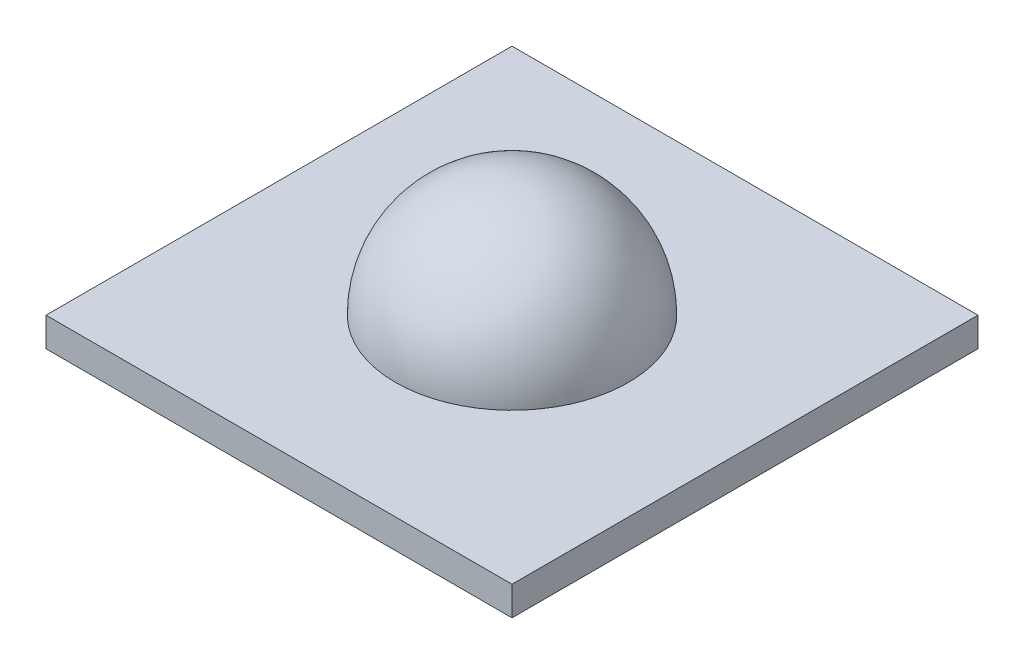
ISO-10303-21;
HEADER;
FILE_DESCRIPTION(('STEP AP214'),'2;1');
FILE_NAME('part.step','',(''),(''),'','','');
FILE_SCHEMA(('AUTOMOTIVE_DESIGN { 1 0 10303 214 1 1 1 1 }'));
ENDSEC;
DATA;
#1=APPLICATION_CONTEXT('core data for automotive mechanical design processes');
#2=APPLICATION_PROTOCOL_DEFINITION('international standard','automotive_design',2000,#1);
#3=PRODUCT_CONTEXT('',#1,'mechanical');
#4=PRODUCT('Part','Part','',(#3));
#5=PRODUCT_RELATED_PRODUCT_CATEGORY('part','',(#4));
#6=PRODUCT_DEFINITION_FORMATION('','',#4);
#7=PRODUCT_DEFINITION_CONTEXT('part definition',#1,'design');
#8=PRODUCT_DEFINITION('design','',#6,#7);
#9=PRODUCT_DEFINITION_SHAPE('','',#8);
#10=(LENGTH_UNIT() NAMED_UNIT(*) SI_UNIT(.MILLI.,.METRE.));
#11=(NAMED_UNIT(*) PLANE_ANGLE_UNIT() SI_UNIT($,.RADIAN.));
#12=(NAMED_UNIT(*) SI_UNIT($,.STERADIAN.) SOLID_ANGLE_UNIT());
#13=UNCERTAINTY_MEASURE_WITH_UNIT(LENGTH_MEASURE(1.E-05),#10,'distance_accuracy_value','');
#14=(GEOMETRIC_REPRESENTATION_CONTEXT(3) GLOBAL_UNCERTAINTY_ASSIGNED_CONTEXT((#13)) GLOBAL_UNIT_ASSIGNED_CONTEXT((#10,
#11,#12)) REPRESENTATION_CONTEXT('',''));
#15=CARTESIAN_POINT('',(0.,0.,0.));
#16=DIRECTION('',(0.,0.,1.));
#17=DIRECTION('',(1.,0.,0.));
#18=AXIS2_PLACEMENT_3D('',#15,#16,#17);
#19=CARTESIAN_POINT('',(0.,5.,0.));
#20=DIRECTION('',(0.,1.,0.));
#21=DIRECTION('',(0.,0.,1.));
#22=AXIS2_PLACEMENT_3D('',#19,#20,#21);
#23=PLANE('',#22);
#24=DIRECTION('',(0.,0.,1.));
#25=VECTOR('',#24,1.);
#26=CARTESIAN_POINT('',(-40.,5.,-40.));
#27=LINE('',#26,#25);
#28=CARTESIAN_POINT('',(-40.,5.,-40.));
#29=VERTEX_POINT('',#28);
#30=CARTESIAN_POINT('',(-40.,5.,40.));
#31=VERTEX_POINT('',#30);
#32=EDGE_CURVE('E84',#29,#31,#27,.T.);
#33=ORIENTED_EDGE('',*,*,#32,.T.);
#34=DIRECTION('',(1.,0.,0.));
#35=VECTOR('',#34,1.);
#36=CARTESIAN_POINT('',(-40.,5.,40.));
#37=LINE('',#36,#35);
#38=CARTESIAN_POINT('',(40.,5.,40.));
#39=VERTEX_POINT('',#38);
#40=EDGE_CURVE('E79',#31,#39,#37,.T.);
#41=ORIENTED_EDGE('',*,*,#40,.T.);
#42=DIRECTION('',(0.,0.,-1.));
#43=VECTOR('',#42,1.);
#44=CARTESIAN_POINT('',(40.,5.,-40.));
#45=LINE('',#44,#43);
#46=CARTESIAN_POINT('',(40.,5.,-40.));
#47=VERTEX_POINT('',#46);
#48=EDGE_CURVE('E82',#39,#47,#45,.T.);
#49=ORIENTED_EDGE('',*,*,#48,.T.);
#50=DIRECTION('',(-1.,0.,0.));
#51=VECTOR('',#50,1.);
#52=CARTESIAN_POINT('',(-40.,5.,-40.));
#53=LINE('',#52,#51);
#54=EDGE_CURVE('E49',#47,#29,#53,.T.);
#55=ORIENTED_EDGE('',*,*,#54,.T.);
#56=EDGE_LOOP('',(#33,#41,#49,#55));
#57=FACE_BOUND('',#56,.T.);
#58=CARTESIAN_POINT('',(0.,5.,0.));
#59=DIRECTION('',(0.,-1.,0.));
#60=DIRECTION('',(0.,0.,-1.));
#61=AXIS2_PLACEMENT_3D('',#58,#59,#60);
#62=CIRCLE('',#61,20.);
#63=CARTESIAN_POINT('',(0.,5.,-20.));
#64=VERTEX_POINT('',#63);
#65=EDGE_CURVE('E99',#64,#64,#62,.T.);
#66=ORIENTED_EDGE('',*,*,#65,.T.);
#67=EDGE_LOOP('',(#66));
#68=FACE_BOUND('',#67,.T.);
#69=ADVANCED_FACE('F32',(#57,#68),#23,.T.);
#70=CARTESIAN_POINT('',(-40.,5.,-40.));
#71=DIRECTION('',(1.,0.,0.));
#72=DIRECTION('',(0.,0.,-1.));
#73=AXIS2_PLACEMENT_3D('',#70,#71,#72);
#74=PLANE('',#73);
#75=DIRECTION('',(0.,0.,1.));
#76=VECTOR('',#75,1.);
#77=CARTESIAN_POINT('',(-40.,0.,-40.));
#78=LINE('',#77,#76);
#79=CARTESIAN_POINT('',(-40.,0.,-40.));
#80=VERTEX_POINT('',#79);
#81=CARTESIAN_POINT('',(-40.,0.,40.));
#82=VERTEX_POINT('',#81);
#83=EDGE_CURVE('E96',#80,#82,#78,.T.);
#84=ORIENTED_EDGE('',*,*,#83,.T.);
#85=DIRECTION('',(0.,-1.,0.));
#86=VECTOR('',#85,1.);
#87=CARTESIAN_POINT('',(-40.,5.,40.));
#88=LINE('',#87,#86);
#89=EDGE_CURVE('E11',#31,#82,#88,.T.);
#90=ORIENTED_EDGE('',*,*,#89,.F.);
#91=ORIENTED_EDGE('',*,*,#32,.F.);
#92=DIRECTION('',(0.,-1.,0.));
#93=VECTOR('',#92,1.);
#94=CARTESIAN_POINT('',(-40.,5.,-40.));
#95=LINE('',#94,#93);
#96=EDGE_CURVE('E92',#29,#80,#95,.T.);
#97=ORIENTED_EDGE('',*,*,#96,.T.);
#98=EDGE_LOOP('',(#84,#90,#91,#97));
#99=FACE_BOUND('',#98,.T.);
#100=ADVANCED_FACE('F34',(#99),#74,.F.);
#101=CARTESIAN_POINT('',(-40.,5.,40.));
#102=DIRECTION('',(0.,0.,-1.));
#103=DIRECTION('',(-1.,0.,0.));
#104=AXIS2_PLACEMENT_3D('',#101,#102,#103);
#105=PLANE('',#104);
#106=DIRECTION('',(1.,0.,0.));
#107=VECTOR('',#106,1.);
#108=CARTESIAN_POINT('',(-40.,0.,40.));
#109=LINE('',#108,#107);
#110=CARTESIAN_POINT('',(40.,0.,40.));
#111=VERTEX_POINT('',#110);
#112=EDGE_CURVE('E88',#82,#111,#109,.T.);
#113=ORIENTED_EDGE('',*,*,#112,.T.);
#114=DIRECTION('',(0.,-1.,0.));
#115=VECTOR('',#114,1.);
#116=CARTESIAN_POINT('',(40.,5.,40.));
#117=LINE('',#116,#115);
#118=EDGE_CURVE('E41',#39,#111,#117,.T.);
#119=ORIENTED_EDGE('',*,*,#118,.F.);
#120=ORIENTED_EDGE('',*,*,#40,.F.);
#121=ORIENTED_EDGE('',*,*,#89,.T.);
#122=EDGE_LOOP('',(#113,#119,#120,#121));
#123=FACE_BOUND('',#122,.T.);
#124=ADVANCED_FACE('F87',(#123),#105,.F.);
#125=CARTESIAN_POINT('',(40.,5.,-40.));
#126=DIRECTION('',(-1.,0.,0.));
#127=DIRECTION('',(0.,0.,1.));
#128=AXIS2_PLACEMENT_3D('',#125,#126,#127);
#129=PLANE('',#128);
#130=DIRECTION('',(0.,0.,-1.));
#131=VECTOR('',#130,1.);
#132=CARTESIAN_POINT('',(40.,0.,-40.));
#133=LINE('',#132,#131);
#134=CARTESIAN_POINT('',(40.,0.,-40.));
#135=VERTEX_POINT('',#134);
#136=EDGE_CURVE('E66',#111,#135,#133,.T.);
#137=ORIENTED_EDGE('',*,*,#136,.T.);
#138=DIRECTION('',(0.,-1.,0.));
#139=VECTOR('',#138,1.);
#140=CARTESIAN_POINT('',(40.,5.,-40.));
#141=LINE('',#140,#139);
#142=EDGE_CURVE('E89',#47,#135,#141,.T.);
#143=ORIENTED_EDGE('',*,*,#142,.F.);
#144=ORIENTED_EDGE('',*,*,#48,.F.);
#145=ORIENTED_EDGE('',*,*,#118,.T.);
#146=EDGE_LOOP('',(#137,#143,#144,#145));
#147=FACE_BOUND('',#146,.T.);
#148=ADVANCED_FACE('F90',(#147),#129,.F.);
#149=CARTESIAN_POINT('',(-40.,5.,-40.));
#150=DIRECTION('',(0.,0.,1.));
#151=DIRECTION('',(1.,0.,0.));
#152=AXIS2_PLACEMENT_3D('',#149,#150,#151);
#153=PLANE('',#152);
#154=DIRECTION('',(-1.,0.,0.));
#155=VECTOR('',#154,1.);
#156=CARTESIAN_POINT('',(-40.,0.,-40.));
#157=LINE('',#156,#155);
#158=EDGE_CURVE('E72',#135,#80,#157,.T.);
#159=ORIENTED_EDGE('',*,*,#158,.T.);
#160=ORIENTED_EDGE('',*,*,#96,.F.);
#161=ORIENTED_EDGE('',*,*,#54,.F.);
#162=ORIENTED_EDGE('',*,*,#142,.T.);
#163=EDGE_LOOP('',(#159,#160,#161,#162));
#164=FACE_BOUND('',#163,.T.);
#165=ADVANCED_FACE('F104',(#164),#153,.F.);
#166=CARTESIAN_POINT('',(0.,0.,0.));
#167=DIRECTION('',(0.,1.,0.));
#168=DIRECTION('',(0.,0.,1.));
#169=AXIS2_PLACEMENT_3D('',#166,#167,#168);
#170=PLANE('',#169);
#171=ORIENTED_EDGE('',*,*,#83,.F.);
#172=ORIENTED_EDGE('',*,*,#158,.F.);
#173=ORIENTED_EDGE('',*,*,#136,.F.);
#174=ORIENTED_EDGE('',*,*,#112,.F.);
#175=EDGE_LOOP('',(#171,#172,#173,#174));
#176=FACE_BOUND('',#175,.T.);
#177=ADVANCED_FACE('F107',(#176),#170,.F.);
#178=CARTESIAN_POINT('',(0.,5.,0.));
#179=DIRECTION('',(0.,-1.,0.));
#180=DIRECTION('',(0.,0.,-1.));
#181=AXIS2_PLACEMENT_3D('',#178,#179,#180);
#182=SPHERICAL_SURFACE('',#181,20.);
#183=ORIENTED_EDGE('',*,*,#65,.F.);
#184=EDGE_LOOP('',(#183));
#185=FACE_BOUND('',#184,.T.);
#186=ADVANCED_FACE('F113',(#185),#182,.T.);
#187=CLOSED_SHELL('',(#69,#100,#124,#148,#165,#177,#186));
#188=MANIFOLD_SOLID_BREP('B2',#187);
#189=ADVANCED_BREP_SHAPE_REPRESENTATION('',(#18,#188),#14);
#190=SHAPE_DEFINITION_REPRESENTATION(#9,#189);
ENDSEC;
END-ISO-10303-21;
